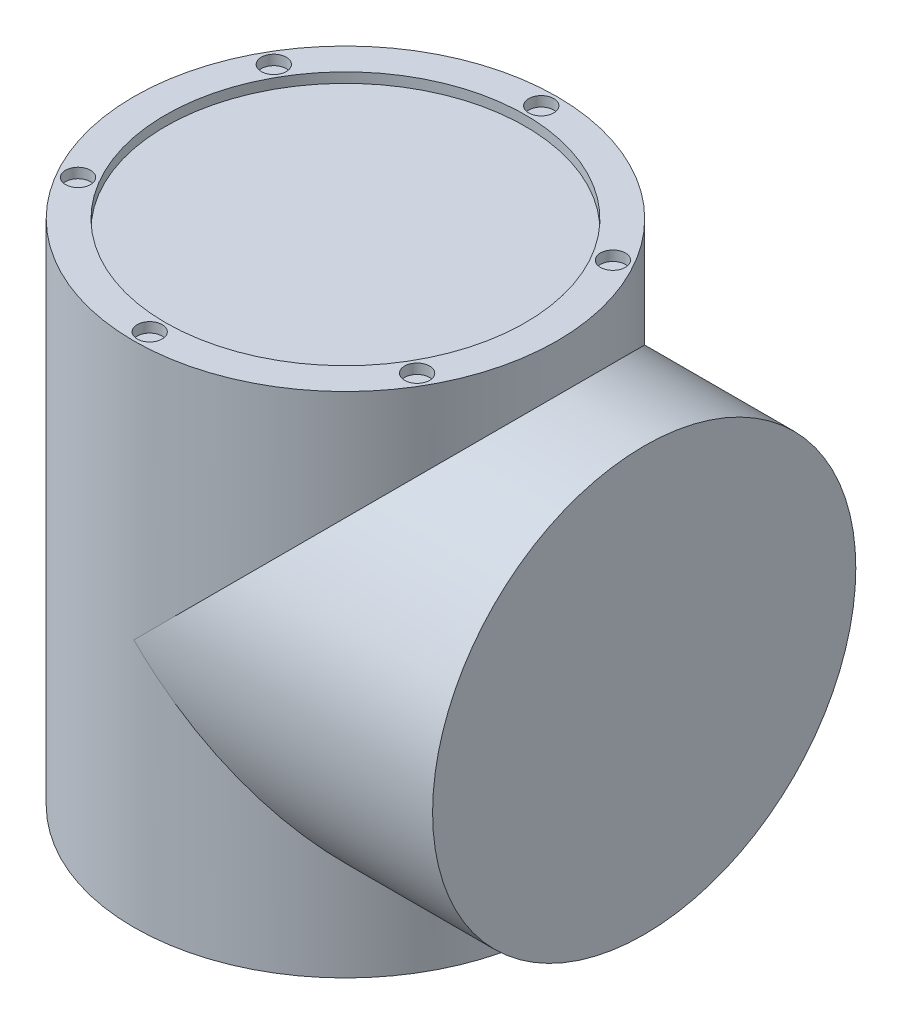
ISO-10303-21;
HEADER;
FILE_DESCRIPTION(('STEP AP214'),'2;1');
FILE_NAME('part.step','',(''),(''),'','','');
FILE_SCHEMA(('AUTOMOTIVE_DESIGN { 1 0 10303 214 1 1 1 1 }'));
ENDSEC;
DATA;
#1=APPLICATION_CONTEXT('core data for automotive mechanical design processes');
#2=APPLICATION_PROTOCOL_DEFINITION('international standard','automotive_design',2000,#1);
#3=PRODUCT_CONTEXT('',#1,'mechanical');
#4=PRODUCT('Part','Part','',(#3));
#5=PRODUCT_RELATED_PRODUCT_CATEGORY('part','',(#4));
#6=PRODUCT_DEFINITION_FORMATION('','',#4);
#7=PRODUCT_DEFINITION_CONTEXT('part definition',#1,'design');
#8=PRODUCT_DEFINITION('design','',#6,#7);
#9=PRODUCT_DEFINITION_SHAPE('','',#8);
#10=(LENGTH_UNIT() NAMED_UNIT(*) SI_UNIT(.MILLI.,.METRE.));
#11=(NAMED_UNIT(*) PLANE_ANGLE_UNIT() SI_UNIT($,.RADIAN.));
#12=(NAMED_UNIT(*) SI_UNIT($,.STERADIAN.) SOLID_ANGLE_UNIT());
#13=UNCERTAINTY_MEASURE_WITH_UNIT(LENGTH_MEASURE(1.E-05),#10,'distance_accuracy_value','');
#14=(GEOMETRIC_REPRESENTATION_CONTEXT(3) GLOBAL_UNCERTAINTY_ASSIGNED_CONTEXT((#13)) GLOBAL_UNIT_ASSIGNED_CONTEXT((#10,
#11,#12)) REPRESENTATION_CONTEXT('',''));
#15=CARTESIAN_POINT('',(0.,0.,0.));
#16=DIRECTION('',(0.,0.,1.));
#17=DIRECTION('',(1.,0.,0.));
#18=AXIS2_PLACEMENT_3D('',#15,#16,#17);
#19=CARTESIAN_POINT('',(0.,100.,0.));
#20=DIRECTION('',(0.,-1.,0.));
#21=DIRECTION('',(0.,0.,-1.));
#22=AXIS2_PLACEMENT_3D('',#19,#20,#21);
#23=CYLINDRICAL_SURFACE('',#22,42.5);
#24=CARTESIAN_POINT('',(0.,0.,0.));
#25=DIRECTION('',(0.,1.,0.));
#26=DIRECTION('',(0.,0.,1.));
#27=AXIS2_PLACEMENT_3D('',#24,#25,#26);
#28=CIRCLE('',#27,42.5);
#29=CARTESIAN_POINT('',(0.,0.,42.5));
#30=VERTEX_POINT('',#29);
#31=EDGE_CURVE('E75',#30,#30,#28,.T.);
#32=ORIENTED_EDGE('',*,*,#31,.T.);
#33=EDGE_LOOP('',(#32));
#34=FACE_BOUND('',#33,.T.);
#35=CARTESIAN_POINT('',(0.,50.,0.));
#36=DIRECTION('',(-0.707106781186547,-0.707106781186547,0.));
#37=DIRECTION('',(0.707106781186547,-0.707106781186547,0.));
#38=AXIS2_PLACEMENT_3D('',#35,#36,#37);
#39=ELLIPSE('',#38,60.1040764008566,42.5);
#40=CARTESIAN_POINT('',(0.,50.,42.5));
#41=VERTEX_POINT('',#40);
#42=CARTESIAN_POINT('',(0.,50.,-42.5));
#43=VERTEX_POINT('',#42);
#44=EDGE_CURVE('E67',#41,#43,#39,.F.);
#45=ORIENTED_EDGE('',*,*,#44,.F.);
#46=CARTESIAN_POINT('',(0.,50.,0.));
#47=DIRECTION('',(0.707106781186547,-0.707106781186547,0.));
#48=DIRECTION('',(-0.707106781186547,-0.707106781186547,0.));
#49=AXIS2_PLACEMENT_3D('',#46,#47,#48);
#50=ELLIPSE('',#49,60.1040764008566,42.5);
#51=EDGE_CURVE('E65',#43,#41,#50,.T.);
#52=ORIENTED_EDGE('',*,*,#51,.F.);
#53=EDGE_LOOP('',(#45,#52));
#54=FACE_BOUND('',#53,.T.);
#55=CARTESIAN_POINT('',(0.,102.,0.));
#56=DIRECTION('',(0.,1.,0.));
#57=DIRECTION('',(0.,0.,1.));
#58=AXIS2_PLACEMENT_3D('',#55,#56,#57);
#59=CIRCLE('',#58,42.5);
#60=CARTESIAN_POINT('',(0.,102.,42.5));
#61=VERTEX_POINT('',#60);
#62=EDGE_CURVE('E211',#61,#61,#59,.T.);
#63=ORIENTED_EDGE('',*,*,#62,.F.);
#64=EDGE_LOOP('',(#63));
#65=FACE_BOUND('',#64,.T.);
#66=ADVANCED_FACE('F51',(#34,#54,#65),#23,.T.);
#67=CARTESIAN_POINT('',(0.,0.,0.));
#68=DIRECTION('',(0.,1.,0.));
#69=DIRECTION('',(0.,0.,1.));
#70=AXIS2_PLACEMENT_3D('',#67,#68,#69);
#71=PLANE('',#70);
#72=ORIENTED_EDGE('',*,*,#31,.F.);
#73=EDGE_LOOP('',(#72));
#74=FACE_BOUND('',#73,.T.);
#75=ADVANCED_FACE('F123',(#74),#71,.F.);
#76=CARTESIAN_POINT('',(60.,50.,0.));
#77=DIRECTION('',(-1.,0.,0.));
#78=DIRECTION('',(0.,0.,1.));
#79=AXIS2_PLACEMENT_3D('',#76,#77,#78);
#80=CYLINDRICAL_SURFACE('',#79,42.5);
#81=CARTESIAN_POINT('',(60.,50.,0.));
#82=DIRECTION('',(1.,0.,0.));
#83=DIRECTION('',(0.,0.,-1.));
#84=AXIS2_PLACEMENT_3D('',#81,#82,#83);
#85=CIRCLE('',#84,42.5);
#86=CARTESIAN_POINT('',(60.,50.,-42.5));
#87=VERTEX_POINT('',#86);
#88=EDGE_CURVE('E79',#87,#87,#85,.T.);
#89=ORIENTED_EDGE('',*,*,#88,.F.);
#90=EDGE_LOOP('',(#89));
#91=FACE_BOUND('',#90,.T.);
#92=ORIENTED_EDGE('',*,*,#51,.T.);
#93=ORIENTED_EDGE('',*,*,#44,.T.);
#94=EDGE_LOOP('',(#92,#93));
#95=FACE_BOUND('',#94,.T.);
#96=ADVANCED_FACE('F73',(#91,#95),#80,.T.);
#97=CARTESIAN_POINT('',(60.,50.,0.));
#98=DIRECTION('',(1.,0.,0.));
#99=DIRECTION('',(0.,0.,-1.));
#100=AXIS2_PLACEMENT_3D('',#97,#98,#99);
#101=PLANE('',#100);
#102=ORIENTED_EDGE('',*,*,#88,.T.);
#103=EDGE_LOOP('',(#102));
#104=FACE_BOUND('',#103,.T.);
#105=ADVANCED_FACE('F134',(#104),#101,.T.);
#106=CARTESIAN_POINT('',(0.,102.,0.));
#107=DIRECTION('',(0.,1.,0.));
#108=DIRECTION('',(0.,0.,1.));
#109=AXIS2_PLACEMENT_3D('',#106,#107,#108);
#110=PLANE('',#109);
#111=CARTESIAN_POINT('',(-34.0513042690047,102.,19.6595296859692));
#112=DIRECTION('',(0.,1.,0.));
#113=DIRECTION('',(0.,0.,1.));
#114=AXIS2_PLACEMENT_3D('',#111,#112,#113);
#115=CIRCLE('',#114,2.50817893346333);
#116=CARTESIAN_POINT('',(-34.0513042690047,102.,22.1677086194325));
#117=VERTEX_POINT('',#116);
#118=EDGE_CURVE('E185',#117,#117,#115,.T.);
#119=ORIENTED_EDGE('',*,*,#118,.F.);
#120=EDGE_LOOP('',(#119));
#121=FACE_BOUND('',#120,.T.);
#122=CARTESIAN_POINT('',(34.0513042690085,102.,19.6595296859685));
#123=DIRECTION('',(0.,1.,0.));
#124=DIRECTION('',(0.,0.,1.));
#125=AXIS2_PLACEMENT_3D('',#122,#123,#124);
#126=CIRCLE('',#125,2.50817893346231);
#127=CARTESIAN_POINT('',(34.0513042690085,102.,22.1677086194308));
#128=VERTEX_POINT('',#127);
#129=EDGE_CURVE('E195',#128,#128,#126,.T.);
#130=ORIENTED_EDGE('',*,*,#129,.F.);
#131=EDGE_LOOP('',(#130));
#132=FACE_BOUND('',#131,.T.);
#133=CARTESIAN_POINT('',(1.28161381428317E-12,102.,-39.3190593719376));
#134=DIRECTION('',(0.,1.,0.));
#135=DIRECTION('',(0.,0.,1.));
#136=AXIS2_PLACEMENT_3D('',#133,#134,#135);
#137=CIRCLE('',#136,2.50817893346016);
#138=CARTESIAN_POINT('',(1.28161381428317E-12,102.,-36.8108804384775));
#139=VERTEX_POINT('',#138);
#140=EDGE_CURVE('E203',#139,#139,#137,.T.);
#141=ORIENTED_EDGE('',*,*,#140,.F.);
#142=EDGE_LOOP('',(#141));
#143=FACE_BOUND('',#142,.T.);
#144=ORIENTED_EDGE('',*,*,#62,.T.);
#145=EDGE_LOOP('',(#144));
#146=FACE_BOUND('',#145,.T.);
#147=CARTESIAN_POINT('',(0.,102.,0.));
#148=DIRECTION('',(0.,1.,0.));
#149=DIRECTION('',(0.,0.,1.));
#150=AXIS2_PLACEMENT_3D('',#147,#148,#149);
#151=CIRCLE('',#150,36.1435952460319);
#152=CARTESIAN_POINT('',(0.,102.,36.1435952460319));
#153=VERTEX_POINT('',#152);
#154=EDGE_CURVE('E207',#153,#153,#151,.T.);
#155=ORIENTED_EDGE('',*,*,#154,.F.);
#156=EDGE_LOOP('',(#155));
#157=FACE_BOUND('',#156,.T.);
#158=CARTESIAN_POINT('',(34.0513042690081,102.,-19.6595296859692));
#159=DIRECTION('',(0.,1.,0.));
#160=DIRECTION('',(0.,0.,1.));
#161=AXIS2_PLACEMENT_3D('',#158,#159,#160);
#162=CIRCLE('',#161,2.50817893346063);
#163=CARTESIAN_POINT('',(34.0513042690081,102.,-17.1513507525085));
#164=VERTEX_POINT('',#163);
#165=EDGE_CURVE('E199',#164,#164,#162,.T.);
#166=ORIENTED_EDGE('',*,*,#165,.F.);
#167=EDGE_LOOP('',(#166));
#168=FACE_BOUND('',#167,.T.);
#169=CARTESIAN_POINT('',(2.05648523929315E-12,102.,39.3190593719376));
#170=DIRECTION('',(0.,1.,0.));
#171=DIRECTION('',(0.,0.,1.));
#172=AXIS2_PLACEMENT_3D('',#169,#170,#171);
#173=CIRCLE('',#172,2.50817893346361);
#174=CARTESIAN_POINT('',(2.05648523929315E-12,102.,41.8272383054012));
#175=VERTEX_POINT('',#174);
#176=EDGE_CURVE('E189',#175,#175,#173,.T.);
#177=ORIENTED_EDGE('',*,*,#176,.F.);
#178=EDGE_LOOP('',(#177));
#179=FACE_BOUND('',#178,.T.);
#180=CARTESIAN_POINT('',(-34.0513042690051,102.,-19.6595296859685));
#181=DIRECTION('',(0.,1.,0.));
#182=DIRECTION('',(0.,0.,1.));
#183=AXIS2_PLACEMENT_3D('',#180,#181,#182);
#184=CIRCLE('',#183,2.50817893346181);
#185=CARTESIAN_POINT('',(-34.0513042690051,102.,-17.1513507525067));
#186=VERTEX_POINT('',#185);
#187=EDGE_CURVE('E181',#186,#186,#184,.T.);
#188=ORIENTED_EDGE('',*,*,#187,.F.);
#189=EDGE_LOOP('',(#188));
#190=FACE_BOUND('',#189,.T.);
#191=ADVANCED_FACE('F140',(#121,#132,#143,#146,#157,#168,#179,#190),#110,.T.);
#192=CARTESIAN_POINT('',(0.,102.,0.));
#193=DIRECTION('',(0.,-1.,0.));
#194=DIRECTION('',(0.,0.,-1.));
#195=AXIS2_PLACEMENT_3D('',#192,#193,#194);
#196=CYLINDRICAL_SURFACE('',#195,36.1435952460319);
#197=ORIENTED_EDGE('',*,*,#154,.T.);
#198=EDGE_LOOP('',(#197));
#199=FACE_BOUND('',#198,.T.);
#200=CARTESIAN_POINT('',(0.,100.,0.));
#201=DIRECTION('',(0.,1.,0.));
#202=DIRECTION('',(0.,0.,1.));
#203=AXIS2_PLACEMENT_3D('',#200,#201,#202);
#204=CIRCLE('',#203,36.1435952460319);
#205=CARTESIAN_POINT('',(0.,100.,36.1435952460319));
#206=VERTEX_POINT('',#205);
#207=EDGE_CURVE('E11',#206,#206,#204,.F.);
#208=ORIENTED_EDGE('',*,*,#207,.T.);
#209=EDGE_LOOP('',(#208));
#210=FACE_BOUND('',#209,.T.);
#211=ADVANCED_FACE('F146',(#199,#210),#196,.F.);
#212=CARTESIAN_POINT('',(1.28161381428317E-12,102.,-39.3190593719376));
#213=DIRECTION('',(0.,-1.,0.));
#214=DIRECTION('',(0.,0.,-1.));
#215=AXIS2_PLACEMENT_3D('',#212,#213,#214);
#216=CYLINDRICAL_SURFACE('',#215,2.50817893346016);
#217=ORIENTED_EDGE('',*,*,#140,.T.);
#218=EDGE_LOOP('',(#217));
#219=FACE_BOUND('',#218,.T.);
#220=CARTESIAN_POINT('',(1.28161381428317E-12,100.,-39.3190593719376));
#221=DIRECTION('',(0.,1.,0.));
#222=DIRECTION('',(0.,0.,1.));
#223=AXIS2_PLACEMENT_3D('',#220,#221,#222);
#224=CIRCLE('',#223,2.50817893346016);
#225=CARTESIAN_POINT('',(1.28161381428317E-12,100.,-36.8108804384775));
#226=VERTEX_POINT('',#225);
#227=EDGE_CURVE('E59',#226,#226,#224,.F.);
#228=ORIENTED_EDGE('',*,*,#227,.T.);
#229=EDGE_LOOP('',(#228));
#230=FACE_BOUND('',#229,.T.);
#231=ADVANCED_FACE('F105',(#219,#230),#216,.F.);
#232=CARTESIAN_POINT('',(34.0513042690081,102.,-19.6595296859692));
#233=DIRECTION('',(0.,-1.,0.));
#234=DIRECTION('',(0.,0.,-1.));
#235=AXIS2_PLACEMENT_3D('',#232,#233,#234);
#236=CYLINDRICAL_SURFACE('',#235,2.50817893346063);
#237=ORIENTED_EDGE('',*,*,#165,.T.);
#238=EDGE_LOOP('',(#237));
#239=FACE_BOUND('',#238,.T.);
#240=CARTESIAN_POINT('',(34.0513042690081,100.,-19.6595296859692));
#241=DIRECTION('',(0.,1.,0.));
#242=DIRECTION('',(0.,0.,1.));
#243=AXIS2_PLACEMENT_3D('',#240,#241,#242);
#244=CIRCLE('',#243,2.50817893346063);
#245=CARTESIAN_POINT('',(34.0513042690081,100.,-17.1513507525085));
#246=VERTEX_POINT('',#245);
#247=EDGE_CURVE('E98',#246,#246,#244,.F.);
#248=ORIENTED_EDGE('',*,*,#247,.T.);
#249=EDGE_LOOP('',(#248));
#250=FACE_BOUND('',#249,.T.);
#251=ADVANCED_FACE('F153',(#239,#250),#236,.F.);
#252=CARTESIAN_POINT('',(34.0513042690085,102.,19.6595296859685));
#253=DIRECTION('',(0.,-1.,0.));
#254=DIRECTION('',(0.,0.,-1.));
#255=AXIS2_PLACEMENT_3D('',#252,#253,#254);
#256=CYLINDRICAL_SURFACE('',#255,2.50817893346231);
#257=ORIENTED_EDGE('',*,*,#129,.T.);
#258=EDGE_LOOP('',(#257));
#259=FACE_BOUND('',#258,.T.);
#260=CARTESIAN_POINT('',(34.0513042690085,100.,19.6595296859685));
#261=DIRECTION('',(0.,1.,0.));
#262=DIRECTION('',(0.,0.,1.));
#263=AXIS2_PLACEMENT_3D('',#260,#261,#262);
#264=CIRCLE('',#263,2.50817893346231);
#265=CARTESIAN_POINT('',(34.0513042690085,100.,22.1677086194308));
#266=VERTEX_POINT('',#265);
#267=EDGE_CURVE('E94',#266,#266,#264,.F.);
#268=ORIENTED_EDGE('',*,*,#267,.T.);
#269=EDGE_LOOP('',(#268));
#270=FACE_BOUND('',#269,.T.);
#271=ADVANCED_FACE('F157',(#259,#270),#256,.F.);
#272=CARTESIAN_POINT('',(2.05648523929315E-12,102.,39.3190593719376));
#273=DIRECTION('',(0.,-1.,0.));
#274=DIRECTION('',(0.,0.,-1.));
#275=AXIS2_PLACEMENT_3D('',#272,#273,#274);
#276=CYLINDRICAL_SURFACE('',#275,2.50817893346361);
#277=ORIENTED_EDGE('',*,*,#176,.T.);
#278=EDGE_LOOP('',(#277));
#279=FACE_BOUND('',#278,.T.);
#280=CARTESIAN_POINT('',(2.05648523929315E-12,100.,39.3190593719376));
#281=DIRECTION('',(0.,1.,0.));
#282=DIRECTION('',(0.,0.,1.));
#283=AXIS2_PLACEMENT_3D('',#280,#281,#282);
#284=CIRCLE('',#283,2.50817893346361);
#285=CARTESIAN_POINT('',(2.05648523929315E-12,100.,41.8272383054012));
#286=VERTEX_POINT('',#285);
#287=EDGE_CURVE('E90',#286,#286,#284,.F.);
#288=ORIENTED_EDGE('',*,*,#287,.T.);
#289=EDGE_LOOP('',(#288));
#290=FACE_BOUND('',#289,.T.);
#291=ADVANCED_FACE('F161',(#279,#290),#276,.F.);
#292=CARTESIAN_POINT('',(-34.0513042690047,102.,19.6595296859692));
#293=DIRECTION('',(0.,-1.,0.));
#294=DIRECTION('',(0.,0.,-1.));
#295=AXIS2_PLACEMENT_3D('',#292,#293,#294);
#296=CYLINDRICAL_SURFACE('',#295,2.50817893346333);
#297=ORIENTED_EDGE('',*,*,#118,.T.);
#298=EDGE_LOOP('',(#297));
#299=FACE_BOUND('',#298,.T.);
#300=CARTESIAN_POINT('',(-34.0513042690047,100.,19.6595296859692));
#301=DIRECTION('',(0.,1.,0.));
#302=DIRECTION('',(0.,0.,1.));
#303=AXIS2_PLACEMENT_3D('',#300,#301,#302);
#304=CIRCLE('',#303,2.50817893346333);
#305=CARTESIAN_POINT('',(-34.0513042690047,100.,22.1677086194325));
#306=VERTEX_POINT('',#305);
#307=EDGE_CURVE('E86',#306,#306,#304,.F.);
#308=ORIENTED_EDGE('',*,*,#307,.T.);
#309=EDGE_LOOP('',(#308));
#310=FACE_BOUND('',#309,.T.);
#311=ADVANCED_FACE('F165',(#299,#310),#296,.F.);
#312=CARTESIAN_POINT('',(-34.0513042690051,102.,-19.6595296859685));
#313=DIRECTION('',(0.,-1.,0.));
#314=DIRECTION('',(0.,0.,-1.));
#315=AXIS2_PLACEMENT_3D('',#312,#313,#314);
#316=CYLINDRICAL_SURFACE('',#315,2.50817893346181);
#317=ORIENTED_EDGE('',*,*,#187,.T.);
#318=EDGE_LOOP('',(#317));
#319=FACE_BOUND('',#318,.T.);
#320=CARTESIAN_POINT('',(-34.0513042690051,100.,-19.6595296859685));
#321=DIRECTION('',(0.,1.,0.));
#322=DIRECTION('',(0.,0.,1.));
#323=AXIS2_PLACEMENT_3D('',#320,#321,#322);
#324=CIRCLE('',#323,2.50817893346181);
#325=CARTESIAN_POINT('',(-34.0513042690051,100.,-17.1513507525067));
#326=VERTEX_POINT('',#325);
#327=EDGE_CURVE('E71',#326,#326,#324,.F.);
#328=ORIENTED_EDGE('',*,*,#327,.T.);
#329=EDGE_LOOP('',(#328));
#330=FACE_BOUND('',#329,.T.);
#331=ADVANCED_FACE('F169',(#319,#330),#316,.F.);
#332=CARTESIAN_POINT('',(0.,100.,0.));
#333=DIRECTION('',(0.,1.,0.));
#334=DIRECTION('',(0.,0.,1.));
#335=AXIS2_PLACEMENT_3D('',#332,#333,#334);
#336=PLANE('',#335);
#337=ORIENTED_EDGE('',*,*,#327,.F.);
#338=EDGE_LOOP('',(#337));
#339=FACE_BOUND('',#338,.T.);
#340=ADVANCED_FACE('F118',(#339),#336,.T.);
#341=ORIENTED_EDGE('',*,*,#307,.F.);
#342=EDGE_LOOP('',(#341));
#343=FACE_BOUND('',#342,.T.);
#344=ADVANCED_FACE('F176',(#343),#336,.T.);
#345=ORIENTED_EDGE('',*,*,#287,.F.);
#346=EDGE_LOOP('',(#345));
#347=FACE_BOUND('',#346,.T.);
#348=ADVANCED_FACE('F227',(#347),#336,.T.);
#349=ORIENTED_EDGE('',*,*,#267,.F.);
#350=EDGE_LOOP('',(#349));
#351=FACE_BOUND('',#350,.T.);
#352=ADVANCED_FACE('F119',(#351),#336,.T.);
#353=ORIENTED_EDGE('',*,*,#247,.F.);
#354=EDGE_LOOP('',(#353));
#355=FACE_BOUND('',#354,.T.);
#356=ADVANCED_FACE('F110',(#355),#336,.T.);
#357=ORIENTED_EDGE('',*,*,#227,.F.);
#358=EDGE_LOOP('',(#357));
#359=FACE_BOUND('',#358,.T.);
#360=ADVANCED_FACE('F107',(#359),#336,.T.);
#361=ORIENTED_EDGE('',*,*,#207,.F.);
#362=EDGE_LOOP('',(#361));
#363=FACE_BOUND('',#362,.T.);
#364=ADVANCED_FACE('F109',(#363),#336,.T.);
#365=CLOSED_SHELL('',(#66,#75,#96,#105,#191,#211,#231,#251,#271,#291,#311,#331,#340,#344,#348,
#352,#356,#360,#364));
#366=MANIFOLD_SOLID_BREP('B2',#365);
#367=ADVANCED_BREP_SHAPE_REPRESENTATION('',(#18,#366),#14);
#368=SHAPE_DEFINITION_REPRESENTATION(#9,#367);
ENDSEC;
END-ISO-10303-21;
